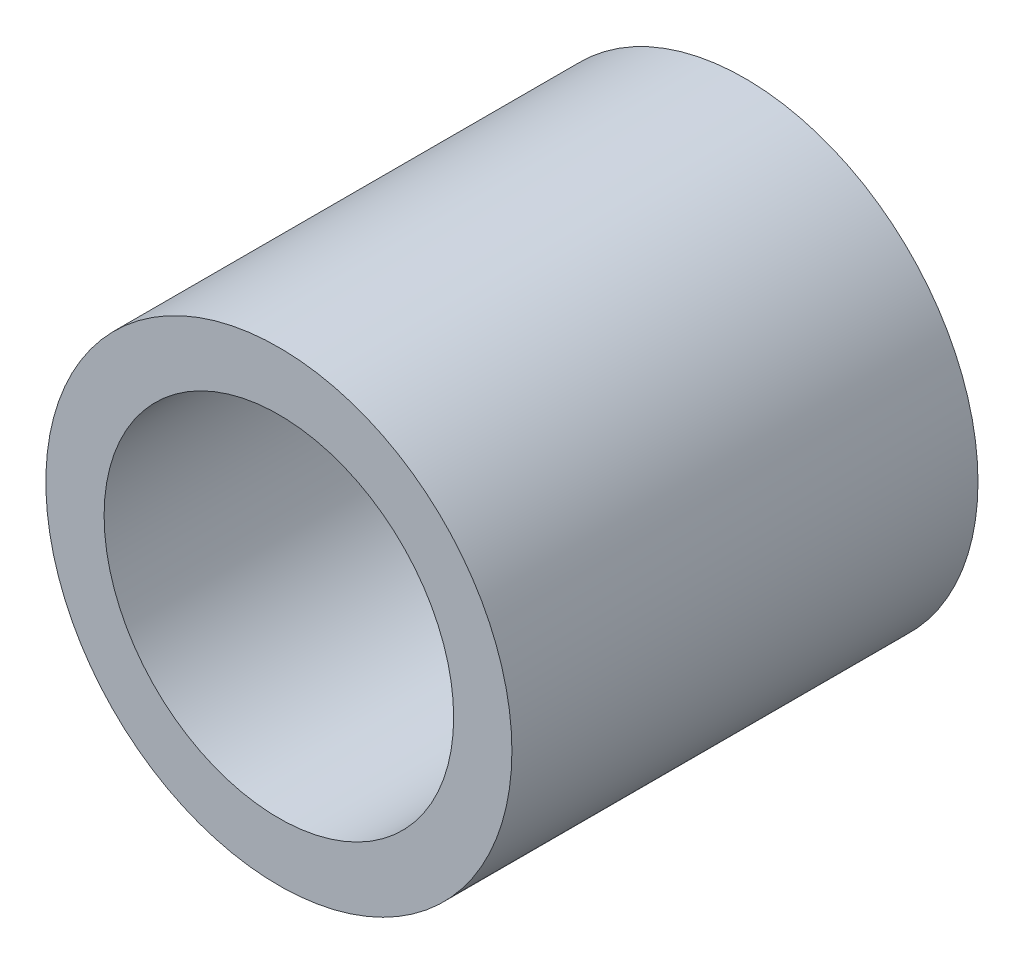
ISO-10303-21;
HEADER;
FILE_DESCRIPTION(('STEP AP214'),'2;1');
FILE_NAME('part.step','',(''),(''),'','','');
FILE_SCHEMA(('AUTOMOTIVE_DESIGN { 1 0 10303 214 1 1 1 1 }'));
ENDSEC;
DATA;
#1=APPLICATION_CONTEXT('core data for automotive mechanical design processes');
#2=APPLICATION_PROTOCOL_DEFINITION('international standard','automotive_design',2000,#1);
#3=PRODUCT_CONTEXT('',#1,'mechanical');
#4=PRODUCT('Part','Part','',(#3));
#5=PRODUCT_RELATED_PRODUCT_CATEGORY('part','',(#4));
#6=PRODUCT_DEFINITION_FORMATION('','',#4);
#7=PRODUCT_DEFINITION_CONTEXT('part definition',#1,'design');
#8=PRODUCT_DEFINITION('design','',#6,#7);
#9=PRODUCT_DEFINITION_SHAPE('','',#8);
#10=(LENGTH_UNIT() NAMED_UNIT(*) SI_UNIT(.MILLI.,.METRE.));
#11=(NAMED_UNIT(*) PLANE_ANGLE_UNIT() SI_UNIT($,.RADIAN.));
#12=(NAMED_UNIT(*) SI_UNIT($,.STERADIAN.) SOLID_ANGLE_UNIT());
#13=UNCERTAINTY_MEASURE_WITH_UNIT(LENGTH_MEASURE(1.E-05),#10,'distance_accuracy_value','');
#14=(GEOMETRIC_REPRESENTATION_CONTEXT(3) GLOBAL_UNCERTAINTY_ASSIGNED_CONTEXT((#13)) GLOBAL_UNIT_ASSIGNED_CONTEXT((#10,
#11,#12)) REPRESENTATION_CONTEXT('',''));
#15=CARTESIAN_POINT('',(0.,0.,0.));
#16=DIRECTION('',(0.,0.,1.));
#17=DIRECTION('',(1.,0.,0.));
#18=AXIS2_PLACEMENT_3D('',#15,#16,#17);
#19=CARTESIAN_POINT('',(0.,0.,50.8));
#20=DIRECTION('',(0.,0.,1.));
#21=DIRECTION('',(1.,0.,0.));
#22=AXIS2_PLACEMENT_3D('',#19,#20,#21);
#23=PLANE('',#22);
#24=CARTESIAN_POINT('',(0.,0.,50.8));
#25=DIRECTION('',(0.,0.,1.));
#26=DIRECTION('',(1.,0.,0.));
#27=AXIS2_PLACEMENT_3D('',#24,#25,#26);
#28=CIRCLE('',#27,25.4);
#29=CARTESIAN_POINT('',(25.4,0.,50.8));
#30=VERTEX_POINT('',#29);
#31=EDGE_CURVE('E10',#30,#30,#28,.T.);
#32=ORIENTED_EDGE('',*,*,#31,.T.);
#33=EDGE_LOOP('',(#32));
#34=FACE_BOUND('',#33,.T.);
#35=CARTESIAN_POINT('',(0.,0.,50.8));
#36=DIRECTION('',(0.,0.,1.));
#37=DIRECTION('',(1.,0.,0.));
#38=AXIS2_PLACEMENT_3D('',#35,#36,#37);
#39=CIRCLE('',#38,19.05);
#40=CARTESIAN_POINT('',(19.05,0.,50.8));
#41=VERTEX_POINT('',#40);
#42=EDGE_CURVE('E44',#41,#41,#39,.T.);
#43=ORIENTED_EDGE('',*,*,#42,.F.);
#44=EDGE_LOOP('',(#43));
#45=FACE_BOUND('',#44,.T.);
#46=ADVANCED_FACE('F33',(#34,#45),#23,.T.);
#47=CARTESIAN_POINT('',(0.,0.,0.));
#48=DIRECTION('',(0.,0.,1.));
#49=DIRECTION('',(1.,0.,0.));
#50=AXIS2_PLACEMENT_3D('',#47,#48,#49);
#51=PLANE('',#50);
#52=CARTESIAN_POINT('',(0.,0.,0.));
#53=DIRECTION('',(0.,0.,1.));
#54=DIRECTION('',(1.,0.,0.));
#55=AXIS2_PLACEMENT_3D('',#52,#53,#54);
#56=CIRCLE('',#55,25.4);
#57=CARTESIAN_POINT('',(25.4,0.,0.));
#58=VERTEX_POINT('',#57);
#59=EDGE_CURVE('E37',#58,#58,#56,.T.);
#60=ORIENTED_EDGE('',*,*,#59,.F.);
#61=EDGE_LOOP('',(#60));
#62=FACE_BOUND('',#61,.T.);
#63=CARTESIAN_POINT('',(0.,0.,0.));
#64=DIRECTION('',(0.,0.,1.));
#65=DIRECTION('',(1.,0.,0.));
#66=AXIS2_PLACEMENT_3D('',#63,#64,#65);
#67=CIRCLE('',#66,19.05);
#68=CARTESIAN_POINT('',(19.05,0.,0.));
#69=VERTEX_POINT('',#68);
#70=EDGE_CURVE('E46',#69,#69,#67,.T.);
#71=ORIENTED_EDGE('',*,*,#70,.T.);
#72=EDGE_LOOP('',(#71));
#73=FACE_BOUND('',#72,.T.);
#74=ADVANCED_FACE('F56',(#62,#73),#51,.F.);
#75=CARTESIAN_POINT('',(0.,0.,50.8));
#76=DIRECTION('',(0.,0.,-1.));
#77=DIRECTION('',(-1.,0.,0.));
#78=AXIS2_PLACEMENT_3D('',#75,#76,#77);
#79=CYLINDRICAL_SURFACE('',#78,25.4);
#80=ORIENTED_EDGE('',*,*,#31,.F.);
#81=EDGE_LOOP('',(#80));
#82=FACE_BOUND('',#81,.T.);
#83=ORIENTED_EDGE('',*,*,#59,.T.);
#84=EDGE_LOOP('',(#83));
#85=FACE_BOUND('',#84,.T.);
#86=ADVANCED_FACE('F35',(#82,#85),#79,.T.);
#87=CARTESIAN_POINT('',(0.,0.,50.8));
#88=DIRECTION('',(0.,0.,-1.));
#89=DIRECTION('',(-1.,0.,0.));
#90=AXIS2_PLACEMENT_3D('',#87,#88,#89);
#91=CYLINDRICAL_SURFACE('',#90,19.05);
#92=ORIENTED_EDGE('',*,*,#42,.T.);
#93=EDGE_LOOP('',(#92));
#94=FACE_BOUND('',#93,.T.);
#95=ORIENTED_EDGE('',*,*,#70,.F.);
#96=EDGE_LOOP('',(#95));
#97=FACE_BOUND('',#96,.T.);
#98=ADVANCED_FACE('F52',(#94,#97),#91,.F.);
#99=CLOSED_SHELL('',(#46,#74,#86,#98));
#100=MANIFOLD_SOLID_BREP('B2',#99);
#101=ADVANCED_BREP_SHAPE_REPRESENTATION('',(#18,#100),#14);
#102=SHAPE_DEFINITION_REPRESENTATION(#9,#101);
ENDSEC;
END-ISO-10303-21;
